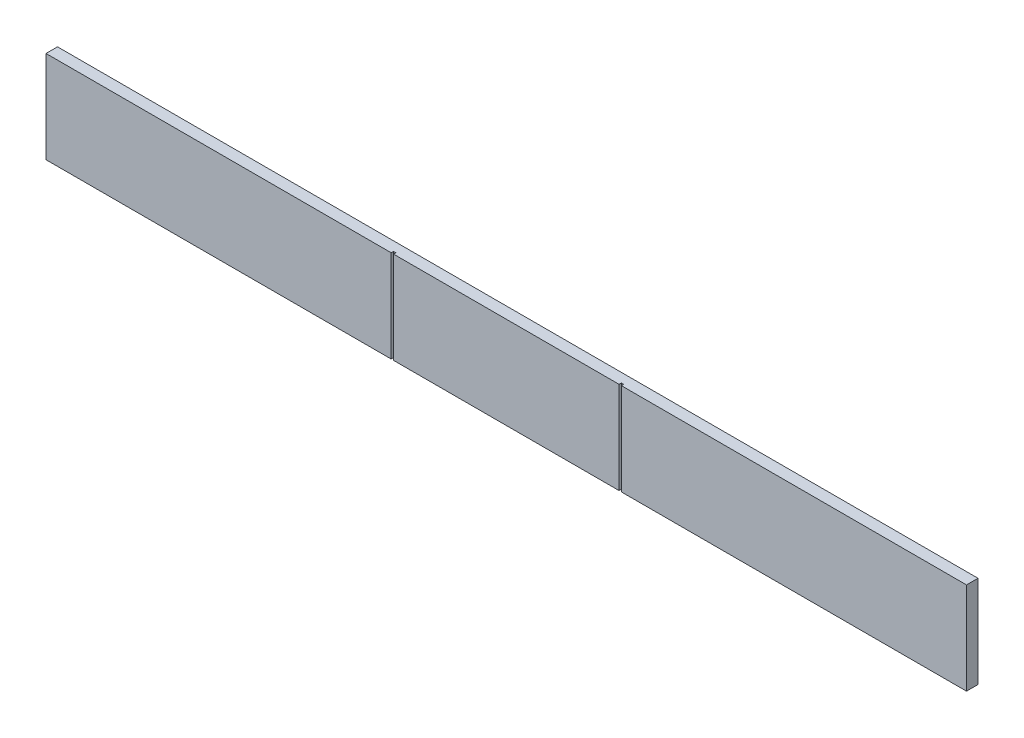
ISO-10303-21;
HEADER;
FILE_DESCRIPTION(('STEP AP214'),'2;1');
FILE_NAME('part.step','',(''),(''),'','','');
FILE_SCHEMA(('AUTOMOTIVE_DESIGN { 1 0 10303 214 1 1 1 1 }'));
ENDSEC;
DATA;
#1=APPLICATION_CONTEXT('core data for automotive mechanical design processes');
#2=APPLICATION_PROTOCOL_DEFINITION('international standard','automotive_design',2000,#1);
#3=PRODUCT_CONTEXT('',#1,'mechanical');
#4=PRODUCT('Part','Part','',(#3));
#5=PRODUCT_RELATED_PRODUCT_CATEGORY('part','',(#4));
#6=PRODUCT_DEFINITION_FORMATION('','',#4);
#7=PRODUCT_DEFINITION_CONTEXT('part definition',#1,'design');
#8=PRODUCT_DEFINITION('design','',#6,#7);
#9=PRODUCT_DEFINITION_SHAPE('','',#8);
#10=(LENGTH_UNIT() NAMED_UNIT(*) SI_UNIT(.MILLI.,.METRE.));
#11=(NAMED_UNIT(*) PLANE_ANGLE_UNIT() SI_UNIT($,.RADIAN.));
#12=(NAMED_UNIT(*) SI_UNIT($,.STERADIAN.) SOLID_ANGLE_UNIT());
#13=UNCERTAINTY_MEASURE_WITH_UNIT(LENGTH_MEASURE(1.E-05),#10,'distance_accuracy_value','');
#14=(GEOMETRIC_REPRESENTATION_CONTEXT(3) GLOBAL_UNCERTAINTY_ASSIGNED_CONTEXT((#13)) GLOBAL_UNIT_ASSIGNED_CONTEXT((#10,
#11,#12)) REPRESENTATION_CONTEXT('',''));
#15=CARTESIAN_POINT('',(0.,0.,0.));
#16=DIRECTION('',(0.,0.,1.));
#17=DIRECTION('',(1.,0.,0.));
#18=AXIS2_PLACEMENT_3D('',#15,#16,#17);
#19=CARTESIAN_POINT('',(0.,0.,6.35));
#20=DIRECTION('',(0.,0.,-1.));
#21=DIRECTION('',(-1.,0.,0.));
#22=AXIS2_PLACEMENT_3D('',#19,#20,#21);
#23=PLANE('',#22);
#24=DIRECTION('',(1.,0.,0.));
#25=VECTOR('',#24,1.);
#26=CARTESIAN_POINT('',(-254.,-25.4,6.35));
#27=LINE('',#26,#25);
#28=CARTESIAN_POINT('',(-254.,-25.4,6.35));
#29=VERTEX_POINT('',#28);
#30=CARTESIAN_POINT('',(-63.5,-25.4,6.35));
#31=VERTEX_POINT('',#30);
#32=EDGE_CURVE('E232',#29,#31,#27,.T.);
#33=ORIENTED_EDGE('',*,*,#32,.T.);
#34=DIRECTION('',(0.,-1.,0.));
#35=VECTOR('',#34,1.);
#36=CARTESIAN_POINT('',(-63.5,25.4,6.35));
#37=LINE('',#36,#35);
#38=CARTESIAN_POINT('',(-63.5,25.4,6.35));
#39=VERTEX_POINT('',#38);
#40=EDGE_CURVE('E140',#39,#31,#37,.T.);
#41=ORIENTED_EDGE('',*,*,#40,.F.);
#42=DIRECTION('',(-1.,0.,0.));
#43=VECTOR('',#42,1.);
#44=CARTESIAN_POINT('',(-254.,25.4,6.35));
#45=LINE('',#44,#43);
#46=CARTESIAN_POINT('',(-254.,25.4,6.35));
#47=VERTEX_POINT('',#46);
#48=EDGE_CURVE('E221',#39,#47,#45,.T.);
#49=ORIENTED_EDGE('',*,*,#48,.T.);
#50=DIRECTION('',(0.,-1.,0.));
#51=VECTOR('',#50,1.);
#52=CARTESIAN_POINT('',(-254.,-25.4,6.35));
#53=LINE('',#52,#51);
#54=EDGE_CURVE('E227',#47,#29,#53,.T.);
#55=ORIENTED_EDGE('',*,*,#54,.T.);
#56=EDGE_LOOP('',(#33,#41,#49,#55));
#57=FACE_BOUND('',#56,.T.);
#58=ADVANCED_FACE('F45',(#57),#23,.F.);
#59=CARTESIAN_POINT('',(62.23,25.4,6.35));
#60=VERTEX_POINT('',#59);
#61=CARTESIAN_POINT('',(-62.23,25.4,6.35));
#62=VERTEX_POINT('',#61);
#63=EDGE_CURVE('E228',#60,#62,#45,.T.);
#64=ORIENTED_EDGE('',*,*,#63,.T.);
#65=DIRECTION('',(0.,1.,0.));
#66=VECTOR('',#65,1.);
#67=CARTESIAN_POINT('',(-62.23,25.4,6.35));
#68=LINE('',#67,#66);
#69=CARTESIAN_POINT('',(-62.23,-25.4,6.35));
#70=VERTEX_POINT('',#69);
#71=EDGE_CURVE('E156',#70,#62,#68,.T.);
#72=ORIENTED_EDGE('',*,*,#71,.F.);
#73=CARTESIAN_POINT('',(62.23,-25.4,6.35));
#74=VERTEX_POINT('',#73);
#75=EDGE_CURVE('E236',#70,#74,#27,.T.);
#76=ORIENTED_EDGE('',*,*,#75,.T.);
#77=DIRECTION('',(0.,-1.,0.));
#78=VECTOR('',#77,1.);
#79=CARTESIAN_POINT('',(62.23,25.4,6.35));
#80=LINE('',#79,#78);
#81=EDGE_CURVE('E170',#60,#74,#80,.T.);
#82=ORIENTED_EDGE('',*,*,#81,.F.);
#83=EDGE_LOOP('',(#64,#72,#76,#82));
#84=FACE_BOUND('',#83,.T.);
#85=ADVANCED_FACE('F281',(#84),#23,.F.);
#86=CARTESIAN_POINT('',(254.,-25.4,6.35));
#87=DIRECTION('',(-1.,0.,0.));
#88=DIRECTION('',(0.,0.,1.));
#89=AXIS2_PLACEMENT_3D('',#86,#87,#88);
#90=PLANE('',#89);
#91=DIRECTION('',(0.,1.,0.));
#92=VECTOR('',#91,1.);
#93=CARTESIAN_POINT('',(254.,-25.4,0.));
#94=LINE('',#93,#92);
#95=CARTESIAN_POINT('',(254.,-25.4,0.));
#96=VERTEX_POINT('',#95);
#97=CARTESIAN_POINT('',(254.,25.4,0.));
#98=VERTEX_POINT('',#97);
#99=EDGE_CURVE('E176',#96,#98,#94,.T.);
#100=ORIENTED_EDGE('',*,*,#99,.T.);
#101=DIRECTION('',(0.,0.,-1.));
#102=VECTOR('',#101,1.);
#103=CARTESIAN_POINT('',(254.,25.4,6.35));
#104=LINE('',#103,#102);
#105=CARTESIAN_POINT('',(254.,25.4,6.35));
#106=VERTEX_POINT('',#105);
#107=EDGE_CURVE('E11',#106,#98,#104,.T.);
#108=ORIENTED_EDGE('',*,*,#107,.F.);
#109=DIRECTION('',(0.,1.,0.));
#110=VECTOR('',#109,1.);
#111=CARTESIAN_POINT('',(254.,-25.4,6.35));
#112=LINE('',#111,#110);
#113=CARTESIAN_POINT('',(254.,-25.4,6.35));
#114=VERTEX_POINT('',#113);
#115=EDGE_CURVE('E217',#114,#106,#112,.T.);
#116=ORIENTED_EDGE('',*,*,#115,.F.);
#117=DIRECTION('',(0.,0.,-1.));
#118=VECTOR('',#117,1.);
#119=CARTESIAN_POINT('',(254.,-25.4,6.35));
#120=LINE('',#119,#118);
#121=EDGE_CURVE('E235',#114,#96,#120,.T.);
#122=ORIENTED_EDGE('',*,*,#121,.T.);
#123=EDGE_LOOP('',(#100,#108,#116,#122));
#124=FACE_BOUND('',#123,.T.);
#125=ADVANCED_FACE('F47',(#124),#90,.F.);
#126=CARTESIAN_POINT('',(-254.,25.4,6.35));
#127=DIRECTION('',(0.,-1.,0.));
#128=DIRECTION('',(0.,0.,-1.));
#129=AXIS2_PLACEMENT_3D('',#126,#127,#128);
#130=PLANE('',#129);
#131=ORIENTED_EDGE('',*,*,#48,.F.);
#132=DIRECTION('',(0.,0.,1.));
#133=VECTOR('',#132,1.);
#134=CARTESIAN_POINT('',(-63.5,25.4,5.08));
#135=LINE('',#134,#133);
#136=CARTESIAN_POINT('',(-63.5,25.4,5.08));
#137=VERTEX_POINT('',#136);
#138=EDGE_CURVE('E173',#137,#39,#135,.T.);
#139=ORIENTED_EDGE('',*,*,#138,.F.);
#140=DIRECTION('',(-1.,0.,0.));
#141=VECTOR('',#140,1.);
#142=CARTESIAN_POINT('',(-63.5,25.4,5.08));
#143=LINE('',#142,#141);
#144=CARTESIAN_POINT('',(-62.23,25.4,5.08));
#145=VERTEX_POINT('',#144);
#146=EDGE_CURVE('E146',#145,#137,#143,.T.);
#147=ORIENTED_EDGE('',*,*,#146,.F.);
#148=DIRECTION('',(0.,0.,1.));
#149=VECTOR('',#148,1.);
#150=CARTESIAN_POINT('',(-62.23,25.4,5.08));
#151=LINE('',#150,#149);
#152=EDGE_CURVE('E177',#145,#62,#151,.T.);
#153=ORIENTED_EDGE('',*,*,#152,.T.);
#154=ORIENTED_EDGE('',*,*,#63,.F.);
#155=DIRECTION('',(0.,0.,1.));
#156=VECTOR('',#155,1.);
#157=CARTESIAN_POINT('',(62.23,25.4,5.08));
#158=LINE('',#157,#156);
#159=CARTESIAN_POINT('',(62.23,25.4,5.08));
#160=VERTEX_POINT('',#159);
#161=EDGE_CURVE('E194',#160,#60,#158,.T.);
#162=ORIENTED_EDGE('',*,*,#161,.F.);
#163=DIRECTION('',(-1.,0.,0.));
#164=VECTOR('',#163,1.);
#165=CARTESIAN_POINT('',(62.23,25.4,5.08));
#166=LINE('',#165,#164);
#167=CARTESIAN_POINT('',(63.5,25.4,5.08));
#168=VERTEX_POINT('',#167);
#169=EDGE_CURVE('E187',#168,#160,#166,.T.);
#170=ORIENTED_EDGE('',*,*,#169,.F.);
#171=DIRECTION('',(0.,0.,1.));
#172=VECTOR('',#171,1.);
#173=CARTESIAN_POINT('',(63.5,25.4,5.08));
#174=LINE('',#173,#172);
#175=CARTESIAN_POINT('',(63.5,25.4,6.35));
#176=VERTEX_POINT('',#175);
#177=EDGE_CURVE('E190',#168,#176,#174,.T.);
#178=ORIENTED_EDGE('',*,*,#177,.T.);
#179=EDGE_CURVE('E223',#106,#176,#45,.T.);
#180=ORIENTED_EDGE('',*,*,#179,.F.);
#181=ORIENTED_EDGE('',*,*,#107,.T.);
#182=DIRECTION('',(-1.,0.,0.));
#183=VECTOR('',#182,1.);
#184=CARTESIAN_POINT('',(-254.,25.4,0.));
#185=LINE('',#184,#183);
#186=CARTESIAN_POINT('',(-254.,25.4,0.));
#187=VERTEX_POINT('',#186);
#188=EDGE_CURVE('E240',#98,#187,#185,.T.);
#189=ORIENTED_EDGE('',*,*,#188,.T.);
#190=DIRECTION('',(0.,0.,-1.));
#191=VECTOR('',#190,1.);
#192=CARTESIAN_POINT('',(-254.,25.4,6.35));
#193=LINE('',#192,#191);
#194=EDGE_CURVE('E54',#47,#187,#193,.T.);
#195=ORIENTED_EDGE('',*,*,#194,.F.);
#196=EDGE_LOOP('',(#131,#139,#147,#153,#154,#162,#170,#178,#180,#181,#189,#195));
#197=FACE_BOUND('',#196,.T.);
#198=ADVANCED_FACE('F290',(#197),#130,.F.);
#199=CARTESIAN_POINT('',(-254.,-25.4,6.35));
#200=DIRECTION('',(1.,0.,0.));
#201=DIRECTION('',(0.,0.,-1.));
#202=AXIS2_PLACEMENT_3D('',#199,#200,#201);
#203=PLANE('',#202);
#204=DIRECTION('',(0.,-1.,0.));
#205=VECTOR('',#204,1.);
#206=CARTESIAN_POINT('',(-254.,-25.4,0.));
#207=LINE('',#206,#205);
#208=CARTESIAN_POINT('',(-254.,-25.4,0.));
#209=VERTEX_POINT('',#208);
#210=EDGE_CURVE('E243',#187,#209,#207,.T.);
#211=ORIENTED_EDGE('',*,*,#210,.T.);
#212=DIRECTION('',(0.,0.,-1.));
#213=VECTOR('',#212,1.);
#214=CARTESIAN_POINT('',(-254.,-25.4,6.35));
#215=LINE('',#214,#213);
#216=EDGE_CURVE('E251',#29,#209,#215,.T.);
#217=ORIENTED_EDGE('',*,*,#216,.F.);
#218=ORIENTED_EDGE('',*,*,#54,.F.);
#219=ORIENTED_EDGE('',*,*,#194,.T.);
#220=EDGE_LOOP('',(#211,#217,#218,#219));
#221=FACE_BOUND('',#220,.T.);
#222=ADVANCED_FACE('F260',(#221),#203,.F.);
#223=CARTESIAN_POINT('',(-254.,-25.4,6.35));
#224=DIRECTION('',(0.,1.,0.));
#225=DIRECTION('',(0.,0.,1.));
#226=AXIS2_PLACEMENT_3D('',#223,#224,#225);
#227=PLANE('',#226);
#228=DIRECTION('',(1.,0.,0.));
#229=VECTOR('',#228,1.);
#230=CARTESIAN_POINT('',(-63.5,-25.4,5.08));
#231=LINE('',#230,#229);
#232=CARTESIAN_POINT('',(-63.5,-25.4,5.08));
#233=VERTEX_POINT('',#232);
#234=CARTESIAN_POINT('',(-62.23,-25.4,5.08));
#235=VERTEX_POINT('',#234);
#236=EDGE_CURVE('E152',#233,#235,#231,.T.);
#237=ORIENTED_EDGE('',*,*,#236,.F.);
#238=DIRECTION('',(0.,0.,1.));
#239=VECTOR('',#238,1.);
#240=CARTESIAN_POINT('',(-63.5,-25.4,5.08));
#241=LINE('',#240,#239);
#242=EDGE_CURVE('E134',#233,#31,#241,.T.);
#243=ORIENTED_EDGE('',*,*,#242,.T.);
#244=ORIENTED_EDGE('',*,*,#32,.F.);
#245=ORIENTED_EDGE('',*,*,#216,.T.);
#246=DIRECTION('',(1.,0.,0.));
#247=VECTOR('',#246,1.);
#248=CARTESIAN_POINT('',(-254.,-25.4,0.));
#249=LINE('',#248,#247);
#250=EDGE_CURVE('E222',#209,#96,#249,.T.);
#251=ORIENTED_EDGE('',*,*,#250,.T.);
#252=ORIENTED_EDGE('',*,*,#121,.F.);
#253=CARTESIAN_POINT('',(63.5,-25.4,6.35));
#254=VERTEX_POINT('',#253);
#255=EDGE_CURVE('E231',#254,#114,#27,.T.);
#256=ORIENTED_EDGE('',*,*,#255,.F.);
#257=DIRECTION('',(0.,0.,1.));
#258=VECTOR('',#257,1.);
#259=CARTESIAN_POINT('',(63.5,-25.4,5.08));
#260=LINE('',#259,#258);
#261=CARTESIAN_POINT('',(63.5,-25.4,5.08));
#262=VERTEX_POINT('',#261);
#263=EDGE_CURVE('E61',#262,#254,#260,.T.);
#264=ORIENTED_EDGE('',*,*,#263,.F.);
#265=DIRECTION('',(1.,0.,0.));
#266=VECTOR('',#265,1.);
#267=CARTESIAN_POINT('',(62.23,-25.4,5.08));
#268=LINE('',#267,#266);
#269=CARTESIAN_POINT('',(62.23,-25.4,5.08));
#270=VERTEX_POINT('',#269);
#271=EDGE_CURVE('E210',#270,#262,#268,.T.);
#272=ORIENTED_EDGE('',*,*,#271,.F.);
#273=DIRECTION('',(0.,0.,1.));
#274=VECTOR('',#273,1.);
#275=CARTESIAN_POINT('',(62.23,-25.4,5.08));
#276=LINE('',#275,#274);
#277=EDGE_CURVE('E183',#270,#74,#276,.T.);
#278=ORIENTED_EDGE('',*,*,#277,.T.);
#279=ORIENTED_EDGE('',*,*,#75,.F.);
#280=DIRECTION('',(0.,0.,1.));
#281=VECTOR('',#280,1.);
#282=CARTESIAN_POINT('',(-62.23,-25.4,5.08));
#283=LINE('',#282,#281);
#284=EDGE_CURVE('E69',#235,#70,#283,.T.);
#285=ORIENTED_EDGE('',*,*,#284,.F.);
#286=EDGE_LOOP('',(#237,#243,#244,#245,#251,#252,#256,#264,#272,#278,#279,#285));
#287=FACE_BOUND('',#286,.T.);
#288=ADVANCED_FACE('F158',(#287),#227,.F.);
#289=ORIENTED_EDGE('',*,*,#179,.T.);
#290=DIRECTION('',(0.,1.,0.));
#291=VECTOR('',#290,1.);
#292=CARTESIAN_POINT('',(63.5,25.4,6.35));
#293=LINE('',#292,#291);
#294=EDGE_CURVE('E197',#254,#176,#293,.T.);
#295=ORIENTED_EDGE('',*,*,#294,.F.);
#296=ORIENTED_EDGE('',*,*,#255,.T.);
#297=ORIENTED_EDGE('',*,*,#115,.T.);
#298=EDGE_LOOP('',(#289,#295,#296,#297));
#299=FACE_BOUND('',#298,.T.);
#300=ADVANCED_FACE('F274',(#299),#23,.F.);
#301=CARTESIAN_POINT('',(0.,0.,0.));
#302=DIRECTION('',(0.,0.,-1.));
#303=DIRECTION('',(-1.,0.,0.));
#304=AXIS2_PLACEMENT_3D('',#301,#302,#303);
#305=PLANE('',#304);
#306=ORIENTED_EDGE('',*,*,#99,.F.);
#307=ORIENTED_EDGE('',*,*,#250,.F.);
#308=ORIENTED_EDGE('',*,*,#210,.F.);
#309=ORIENTED_EDGE('',*,*,#188,.F.);
#310=EDGE_LOOP('',(#306,#307,#308,#309));
#311=FACE_BOUND('',#310,.T.);
#312=ADVANCED_FACE('F267',(#311),#305,.T.);
#313=CARTESIAN_POINT('',(62.23,25.4,5.08));
#314=DIRECTION('',(-1.,0.,0.));
#315=DIRECTION('',(0.,-1.,0.));
#316=AXIS2_PLACEMENT_3D('',#313,#314,#315);
#317=PLANE('',#316);
#318=ORIENTED_EDGE('',*,*,#81,.T.);
#319=ORIENTED_EDGE('',*,*,#277,.F.);
#320=DIRECTION('',(0.,-1.,0.));
#321=VECTOR('',#320,1.);
#322=CARTESIAN_POINT('',(62.23,25.4,5.08));
#323=LINE('',#322,#321);
#324=EDGE_CURVE('E200',#160,#270,#323,.T.);
#325=ORIENTED_EDGE('',*,*,#324,.F.);
#326=ORIENTED_EDGE('',*,*,#161,.T.);
#327=EDGE_LOOP('',(#318,#319,#325,#326));
#328=FACE_BOUND('',#327,.T.);
#329=ADVANCED_FACE('F285',(#328),#317,.F.);
#330=CARTESIAN_POINT('',(63.5,25.4,5.08));
#331=DIRECTION('',(1.,0.,0.));
#332=DIRECTION('',(0.,0.,-1.));
#333=AXIS2_PLACEMENT_3D('',#330,#331,#332);
#334=PLANE('',#333);
#335=ORIENTED_EDGE('',*,*,#294,.T.);
#336=ORIENTED_EDGE('',*,*,#177,.F.);
#337=DIRECTION('',(0.,1.,0.));
#338=VECTOR('',#337,1.);
#339=CARTESIAN_POINT('',(63.5,25.4,5.08));
#340=LINE('',#339,#338);
#341=EDGE_CURVE('E206',#262,#168,#340,.T.);
#342=ORIENTED_EDGE('',*,*,#341,.F.);
#343=ORIENTED_EDGE('',*,*,#263,.T.);
#344=EDGE_LOOP('',(#335,#336,#342,#343));
#345=FACE_BOUND('',#344,.T.);
#346=ADVANCED_FACE('F349',(#345),#334,.F.);
#347=CARTESIAN_POINT('',(0.,0.,5.08));
#348=DIRECTION('',(0.,0.,1.));
#349=DIRECTION('',(1.,0.,0.));
#350=AXIS2_PLACEMENT_3D('',#347,#348,#349);
#351=PLANE('',#350);
#352=ORIENTED_EDGE('',*,*,#324,.T.);
#353=ORIENTED_EDGE('',*,*,#271,.T.);
#354=ORIENTED_EDGE('',*,*,#341,.T.);
#355=ORIENTED_EDGE('',*,*,#169,.T.);
#356=EDGE_LOOP('',(#352,#353,#354,#355));
#357=FACE_BOUND('',#356,.T.);
#358=ADVANCED_FACE('F287',(#357),#351,.T.);
#359=CARTESIAN_POINT('',(-63.5,25.4,5.08));
#360=DIRECTION('',(-1.,0.,0.));
#361=DIRECTION('',(0.,0.,1.));
#362=AXIS2_PLACEMENT_3D('',#359,#360,#361);
#363=PLANE('',#362);
#364=ORIENTED_EDGE('',*,*,#40,.T.);
#365=ORIENTED_EDGE('',*,*,#242,.F.);
#366=DIRECTION('',(0.,-1.,0.));
#367=VECTOR('',#366,1.);
#368=CARTESIAN_POINT('',(-63.5,25.4,5.08));
#369=LINE('',#368,#367);
#370=EDGE_CURVE('E137',#137,#233,#369,.T.);
#371=ORIENTED_EDGE('',*,*,#370,.F.);
#372=ORIENTED_EDGE('',*,*,#138,.T.);
#373=EDGE_LOOP('',(#364,#365,#371,#372));
#374=FACE_BOUND('',#373,.T.);
#375=ADVANCED_FACE('F136',(#374),#363,.F.);
#376=CARTESIAN_POINT('',(-62.23,25.4,5.08));
#377=DIRECTION('',(1.,0.,0.));
#378=DIRECTION('',(0.,1.,0.));
#379=AXIS2_PLACEMENT_3D('',#376,#377,#378);
#380=PLANE('',#379);
#381=ORIENTED_EDGE('',*,*,#71,.T.);
#382=ORIENTED_EDGE('',*,*,#152,.F.);
#383=DIRECTION('',(0.,1.,0.));
#384=VECTOR('',#383,1.);
#385=CARTESIAN_POINT('',(-62.23,25.4,5.08));
#386=LINE('',#385,#384);
#387=EDGE_CURVE('E161',#235,#145,#386,.T.);
#388=ORIENTED_EDGE('',*,*,#387,.F.);
#389=ORIENTED_EDGE('',*,*,#284,.T.);
#390=EDGE_LOOP('',(#381,#382,#388,#389));
#391=FACE_BOUND('',#390,.T.);
#392=ADVANCED_FACE('F373',(#391),#380,.F.);
#393=CARTESIAN_POINT('',(0.,0.,5.08));
#394=DIRECTION('',(0.,0.,1.));
#395=DIRECTION('',(1.,0.,0.));
#396=AXIS2_PLACEMENT_3D('',#393,#394,#395);
#397=PLANE('',#396);
#398=ORIENTED_EDGE('',*,*,#370,.T.);
#399=ORIENTED_EDGE('',*,*,#236,.T.);
#400=ORIENTED_EDGE('',*,*,#387,.T.);
#401=ORIENTED_EDGE('',*,*,#146,.T.);
#402=EDGE_LOOP('',(#398,#399,#400,#401));
#403=FACE_BOUND('',#402,.T.);
#404=ADVANCED_FACE('F150',(#403),#397,.T.);
#405=CLOSED_SHELL('',(#58,#85,#125,#198,#222,#288,#300,#312,#329,#346,#358,#375,#392,#404));
#406=MANIFOLD_SOLID_BREP('B2',#405);
#407=ADVANCED_BREP_SHAPE_REPRESENTATION('',(#18,#406),#14);
#408=SHAPE_DEFINITION_REPRESENTATION(#9,#407);
ENDSEC;
END-ISO-10303-21;
